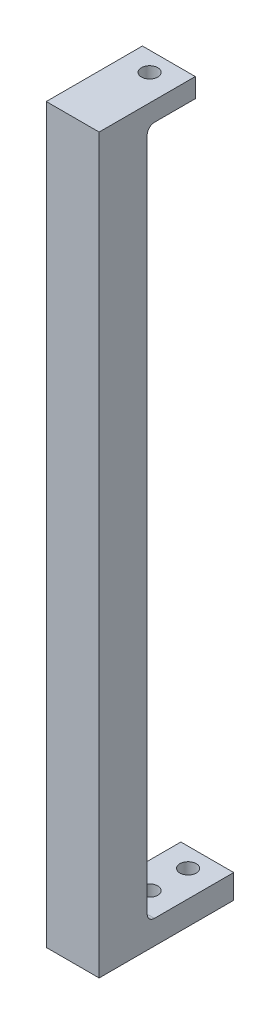
ISO-10303-21;
HEADER;
FILE_DESCRIPTION(('STEP AP214'),'2;1');
FILE_NAME('part.step','',(''),(''),'','','');
FILE_SCHEMA(('AUTOMOTIVE_DESIGN { 1 0 10303 214 1 1 1 1 }'));
ENDSEC;
DATA;
#1=APPLICATION_CONTEXT('core data for automotive mechanical design processes');
#2=APPLICATION_PROTOCOL_DEFINITION('international standard','automotive_design',2000,#1);
#3=PRODUCT_CONTEXT('',#1,'mechanical');
#4=PRODUCT('Part','Part','',(#3));
#5=PRODUCT_RELATED_PRODUCT_CATEGORY('part','',(#4));
#6=PRODUCT_DEFINITION_FORMATION('','',#4);
#7=PRODUCT_DEFINITION_CONTEXT('part definition',#1,'design');
#8=PRODUCT_DEFINITION('design','',#6,#7);
#9=PRODUCT_DEFINITION_SHAPE('','',#8);
#10=(LENGTH_UNIT() NAMED_UNIT(*) SI_UNIT(.MILLI.,.METRE.));
#11=(NAMED_UNIT(*) PLANE_ANGLE_UNIT() SI_UNIT($,.RADIAN.));
#12=(NAMED_UNIT(*) SI_UNIT($,.STERADIAN.) SOLID_ANGLE_UNIT());
#13=UNCERTAINTY_MEASURE_WITH_UNIT(LENGTH_MEASURE(1.E-05),#10,'distance_accuracy_value','');
#14=(GEOMETRIC_REPRESENTATION_CONTEXT(3) GLOBAL_UNCERTAINTY_ASSIGNED_CONTEXT((#13)) GLOBAL_UNIT_ASSIGNED_CONTEXT((#10,
#11,#12)) REPRESENTATION_CONTEXT('',''));
#15=CARTESIAN_POINT('',(0.,0.,0.));
#16=DIRECTION('',(0.,0.,1.));
#17=DIRECTION('',(1.,0.,0.));
#18=AXIS2_PLACEMENT_3D('',#15,#16,#17);
#19=CARTESIAN_POINT('',(-5.5,76.2,-5.));
#20=DIRECTION('',(0.,0.,1.));
#21=DIRECTION('',(1.,0.,0.));
#22=AXIS2_PLACEMENT_3D('',#19,#20,#21);
#23=PLANE('',#22);
#24=DIRECTION('',(0.,-1.,0.));
#25=VECTOR('',#24,1.);
#26=CARTESIAN_POINT('',(-5.5,76.2,-5.));
#27=LINE('',#26,#25);
#28=CARTESIAN_POINT('',(-5.5,70.7,-5.));
#29=VERTEX_POINT('',#28);
#30=CARTESIAN_POINT('',(-5.5,-69.6999999999999,-5.));
#31=VERTEX_POINT('',#30);
#32=EDGE_CURVE('E175',#29,#31,#27,.T.);
#33=ORIENTED_EDGE('',*,*,#32,.F.);
#34=DIRECTION('',(1.,0.,0.));
#35=VECTOR('',#34,1.);
#36=CARTESIAN_POINT('',(-5.5,70.7,-5.));
#37=LINE('',#36,#35);
#38=CARTESIAN_POINT('',(5.5,70.7,-5.));
#39=VERTEX_POINT('',#38);
#40=EDGE_CURVE('E182',#29,#39,#37,.T.);
#41=ORIENTED_EDGE('',*,*,#40,.T.);
#42=DIRECTION('',(0.,-1.,0.));
#43=VECTOR('',#42,1.);
#44=CARTESIAN_POINT('',(5.5,76.2,-5.));
#45=LINE('',#44,#43);
#46=CARTESIAN_POINT('',(5.5,-69.6999999999999,-5.));
#47=VERTEX_POINT('',#46);
#48=EDGE_CURVE('E177',#39,#47,#45,.T.);
#49=ORIENTED_EDGE('',*,*,#48,.T.);
#50=DIRECTION('',(1.,0.,0.));
#51=VECTOR('',#50,1.);
#52=CARTESIAN_POINT('',(-5.5,-69.7,-5.));
#53=LINE('',#52,#51);
#54=EDGE_CURVE('E180',#47,#31,#53,.F.);
#55=ORIENTED_EDGE('',*,*,#54,.T.);
#56=EDGE_LOOP('',(#33,#41,#49,#55));
#57=FACE_BOUND('',#56,.T.);
#58=ADVANCED_FACE('F32',(#57),#23,.F.);
#59=CARTESIAN_POINT('',(5.5,76.2,-5.));
#60=DIRECTION('',(-1.,0.,0.));
#61=DIRECTION('',(0.,0.,1.));
#62=AXIS2_PLACEMENT_3D('',#59,#60,#61);
#63=PLANE('',#62);
#64=DIRECTION('',(0.,0.,-1.));
#65=VECTOR('',#64,1.);
#66=CARTESIAN_POINT('',(5.5,-76.2,-5.));
#67=LINE('',#66,#65);
#68=CARTESIAN_POINT('',(5.5,-76.2,5.));
#69=VERTEX_POINT('',#68);
#70=CARTESIAN_POINT('',(5.5,-76.2,-23.));
#71=VERTEX_POINT('',#70);
#72=EDGE_CURVE('E156',#69,#71,#67,.T.);
#73=ORIENTED_EDGE('',*,*,#72,.T.);
#74=DIRECTION('',(0.,-1.,0.));
#75=VECTOR('',#74,1.);
#76=CARTESIAN_POINT('',(5.5,-71.2,-23.));
#77=LINE('',#76,#75);
#78=CARTESIAN_POINT('',(5.5,-71.2,-23.));
#79=VERTEX_POINT('',#78);
#80=EDGE_CURVE('E122',#79,#71,#77,.T.);
#81=ORIENTED_EDGE('',*,*,#80,.F.);
#82=DIRECTION('',(0.,0.,1.));
#83=VECTOR('',#82,1.);
#84=CARTESIAN_POINT('',(5.5,-71.2,5.));
#85=LINE('',#84,#83);
#86=CARTESIAN_POINT('',(5.5,-71.2,-6.5));
#87=VERTEX_POINT('',#86);
#88=EDGE_CURVE('E123',#79,#87,#85,.T.);
#89=ORIENTED_EDGE('',*,*,#88,.T.);
#90=CARTESIAN_POINT('',(5.5,-69.7,-6.5));
#91=DIRECTION('',(-1.,0.,0.));
#92=DIRECTION('',(0.,0.,1.));
#93=AXIS2_PLACEMENT_3D('',#90,#91,#92);
#94=CIRCLE('',#93,1.5);
#95=EDGE_CURVE('E40',#87,#47,#94,.T.);
#96=ORIENTED_EDGE('',*,*,#95,.T.);
#97=ORIENTED_EDGE('',*,*,#48,.F.);
#98=CARTESIAN_POINT('',(5.5,70.7,-6.5));
#99=DIRECTION('',(-1.,0.,0.));
#100=DIRECTION('',(0.,0.,1.));
#101=AXIS2_PLACEMENT_3D('',#98,#99,#100);
#102=CIRCLE('',#101,1.5);
#103=CARTESIAN_POINT('',(5.5,72.2,-6.5));
#104=VERTEX_POINT('',#103);
#105=EDGE_CURVE('E189',#39,#104,#102,.T.);
#106=ORIENTED_EDGE('',*,*,#105,.T.);
#107=DIRECTION('',(0.,0.,-1.));
#108=VECTOR('',#107,1.);
#109=CARTESIAN_POINT('',(5.5,72.2,-15.));
#110=LINE('',#109,#108);
#111=CARTESIAN_POINT('',(5.5,72.2,-15.));
#112=VERTEX_POINT('',#111);
#113=EDGE_CURVE('E142',#104,#112,#110,.T.);
#114=ORIENTED_EDGE('',*,*,#113,.T.);
#115=DIRECTION('',(0.,1.,0.));
#116=VECTOR('',#115,1.);
#117=CARTESIAN_POINT('',(5.5,72.2,-15.));
#118=LINE('',#117,#116);
#119=CARTESIAN_POINT('',(5.5,76.2,-15.));
#120=VERTEX_POINT('',#119);
#121=EDGE_CURVE('E150',#112,#120,#118,.T.);
#122=ORIENTED_EDGE('',*,*,#121,.T.);
#123=DIRECTION('',(0.,0.,-1.));
#124=VECTOR('',#123,1.);
#125=CARTESIAN_POINT('',(5.5,76.2,-5.));
#126=LINE('',#125,#124);
#127=CARTESIAN_POINT('',(5.5,76.2,5.));
#128=VERTEX_POINT('',#127);
#129=EDGE_CURVE('E159',#128,#120,#126,.T.);
#130=ORIENTED_EDGE('',*,*,#129,.F.);
#131=DIRECTION('',(0.,-1.,0.));
#132=VECTOR('',#131,1.);
#133=CARTESIAN_POINT('',(5.5,76.2,5.));
#134=LINE('',#133,#132);
#135=EDGE_CURVE('E166',#128,#69,#134,.T.);
#136=ORIENTED_EDGE('',*,*,#135,.T.);
#137=EDGE_LOOP('',(#73,#81,#89,#96,#97,#106,#114,#122,#130,#136));
#138=FACE_BOUND('',#137,.T.);
#139=ADVANCED_FACE('F194',(#138),#63,.F.);
#140=CARTESIAN_POINT('',(-5.5,76.2,-5.));
#141=DIRECTION('',(1.,0.,0.));
#142=DIRECTION('',(0.,0.,-1.));
#143=AXIS2_PLACEMENT_3D('',#140,#141,#142);
#144=PLANE('',#143);
#145=DIRECTION('',(0.,0.,1.));
#146=VECTOR('',#145,1.);
#147=CARTESIAN_POINT('',(-5.5,-76.2,-5.));
#148=LINE('',#147,#146);
#149=CARTESIAN_POINT('',(-5.5,-76.2,-23.));
#150=VERTEX_POINT('',#149);
#151=CARTESIAN_POINT('',(-5.5,-76.2,5.));
#152=VERTEX_POINT('',#151);
#153=EDGE_CURVE('E168',#150,#152,#148,.T.);
#154=ORIENTED_EDGE('',*,*,#153,.T.);
#155=DIRECTION('',(0.,-1.,0.));
#156=VECTOR('',#155,1.);
#157=CARTESIAN_POINT('',(-5.5,76.2,5.));
#158=LINE('',#157,#156);
#159=CARTESIAN_POINT('',(-5.5,76.2,5.));
#160=VERTEX_POINT('',#159);
#161=EDGE_CURVE('E173',#160,#152,#158,.T.);
#162=ORIENTED_EDGE('',*,*,#161,.F.);
#163=DIRECTION('',(0.,0.,1.));
#164=VECTOR('',#163,1.);
#165=CARTESIAN_POINT('',(-5.5,76.2,-5.));
#166=LINE('',#165,#164);
#167=CARTESIAN_POINT('',(-5.5,76.2,-15.));
#168=VERTEX_POINT('',#167);
#169=EDGE_CURVE('E161',#168,#160,#166,.T.);
#170=ORIENTED_EDGE('',*,*,#169,.F.);
#171=DIRECTION('',(0.,1.,0.));
#172=VECTOR('',#171,1.);
#173=CARTESIAN_POINT('',(-5.5,72.2,-15.));
#174=LINE('',#173,#172);
#175=CARTESIAN_POINT('',(-5.5,72.2,-15.));
#176=VERTEX_POINT('',#175);
#177=EDGE_CURVE('E153',#176,#168,#174,.T.);
#178=ORIENTED_EDGE('',*,*,#177,.F.);
#179=DIRECTION('',(0.,0.,1.));
#180=VECTOR('',#179,1.);
#181=CARTESIAN_POINT('',(-5.5,72.2,-15.));
#182=LINE('',#181,#180);
#183=CARTESIAN_POINT('',(-5.5,72.2,-6.5));
#184=VERTEX_POINT('',#183);
#185=EDGE_CURVE('E147',#176,#184,#182,.T.);
#186=ORIENTED_EDGE('',*,*,#185,.T.);
#187=CARTESIAN_POINT('',(-5.5,70.7,-6.5));
#188=DIRECTION('',(1.,0.,0.));
#189=DIRECTION('',(0.,0.,-1.));
#190=AXIS2_PLACEMENT_3D('',#187,#188,#189);
#191=CIRCLE('',#190,1.5);
#192=EDGE_CURVE('E191',#184,#29,#191,.T.);
#193=ORIENTED_EDGE('',*,*,#192,.T.);
#194=ORIENTED_EDGE('',*,*,#32,.T.);
#195=CARTESIAN_POINT('',(-5.5,-69.7,-6.5));
#196=DIRECTION('',(1.,0.,0.));
#197=DIRECTION('',(0.,0.,-1.));
#198=AXIS2_PLACEMENT_3D('',#195,#196,#197);
#199=CIRCLE('',#198,1.5);
#200=CARTESIAN_POINT('',(-5.5,-71.2,-6.5));
#201=VERTEX_POINT('',#200);
#202=EDGE_CURVE('E11',#31,#201,#199,.T.);
#203=ORIENTED_EDGE('',*,*,#202,.T.);
#204=DIRECTION('',(0.,0.,-1.));
#205=VECTOR('',#204,1.);
#206=CARTESIAN_POINT('',(-5.5,-71.2,5.));
#207=LINE('',#206,#205);
#208=CARTESIAN_POINT('',(-5.5,-71.2,-23.));
#209=VERTEX_POINT('',#208);
#210=EDGE_CURVE('E106',#201,#209,#207,.T.);
#211=ORIENTED_EDGE('',*,*,#210,.T.);
#212=DIRECTION('',(0.,-1.,0.));
#213=VECTOR('',#212,1.);
#214=CARTESIAN_POINT('',(-5.5,-71.2,-23.));
#215=LINE('',#214,#213);
#216=EDGE_CURVE('E110',#209,#150,#215,.T.);
#217=ORIENTED_EDGE('',*,*,#216,.T.);
#218=EDGE_LOOP('',(#154,#162,#170,#178,#186,#193,#194,#203,#211,#217));
#219=FACE_BOUND('',#218,.T.);
#220=ADVANCED_FACE('F109',(#219),#144,.F.);
#221=CARTESIAN_POINT('',(-5.5,76.2,5.));
#222=DIRECTION('',(0.,0.,-1.));
#223=DIRECTION('',(-1.,0.,0.));
#224=AXIS2_PLACEMENT_3D('',#221,#222,#223);
#225=PLANE('',#224);
#226=DIRECTION('',(1.,0.,0.));
#227=VECTOR('',#226,1.);
#228=CARTESIAN_POINT('',(-5.5,-76.2,5.));
#229=LINE('',#228,#227);
#230=EDGE_CURVE('E162',#152,#69,#229,.T.);
#231=ORIENTED_EDGE('',*,*,#230,.T.);
#232=ORIENTED_EDGE('',*,*,#135,.F.);
#233=DIRECTION('',(1.,0.,0.));
#234=VECTOR('',#233,1.);
#235=CARTESIAN_POINT('',(-5.5,76.2,5.));
#236=LINE('',#235,#234);
#237=EDGE_CURVE('E164',#160,#128,#236,.T.);
#238=ORIENTED_EDGE('',*,*,#237,.F.);
#239=ORIENTED_EDGE('',*,*,#161,.T.);
#240=EDGE_LOOP('',(#231,#232,#238,#239));
#241=FACE_BOUND('',#240,.T.);
#242=ADVANCED_FACE('F214',(#241),#225,.F.);
#243=CARTESIAN_POINT('',(0.,76.2,0.));
#244=DIRECTION('',(0.,1.,0.));
#245=DIRECTION('',(0.,0.,1.));
#246=AXIS2_PLACEMENT_3D('',#243,#244,#245);
#247=PLANE('',#246);
#248=ORIENTED_EDGE('',*,*,#129,.T.);
#249=DIRECTION('',(-1.,0.,0.));
#250=VECTOR('',#249,1.);
#251=CARTESIAN_POINT('',(5.5,76.2,-15.));
#252=LINE('',#251,#250);
#253=EDGE_CURVE('E139',#120,#168,#252,.T.);
#254=ORIENTED_EDGE('',*,*,#253,.T.);
#255=ORIENTED_EDGE('',*,*,#169,.T.);
#256=ORIENTED_EDGE('',*,*,#237,.T.);
#257=EDGE_LOOP('',(#248,#254,#255,#256));
#258=FACE_BOUND('',#257,.T.);
#259=CARTESIAN_POINT('',(0.,76.2,-11.));
#260=DIRECTION('',(0.,1.,0.));
#261=DIRECTION('',(0.,0.,1.));
#262=AXIS2_PLACEMENT_3D('',#259,#260,#261);
#263=CIRCLE('',#262,1.7);
#264=CARTESIAN_POINT('',(0.,76.2,-9.3));
#265=VERTEX_POINT('',#264);
#266=EDGE_CURVE('E134',#265,#265,#263,.T.);
#267=ORIENTED_EDGE('',*,*,#266,.F.);
#268=EDGE_LOOP('',(#267));
#269=FACE_BOUND('',#268,.T.);
#270=ADVANCED_FACE('F217',(#258,#269),#247,.T.);
#271=CARTESIAN_POINT('',(0.,-76.2,0.));
#272=DIRECTION('',(0.,1.,0.));
#273=DIRECTION('',(0.,0.,1.));
#274=AXIS2_PLACEMENT_3D('',#271,#272,#273);
#275=PLANE('',#274);
#276=ORIENTED_EDGE('',*,*,#72,.F.);
#277=ORIENTED_EDGE('',*,*,#230,.F.);
#278=ORIENTED_EDGE('',*,*,#153,.F.);
#279=DIRECTION('',(1.,0.,0.));
#280=VECTOR('',#279,1.);
#281=CARTESIAN_POINT('',(-5.5,-76.2,-23.));
#282=LINE('',#281,#280);
#283=EDGE_CURVE('E115',#150,#71,#282,.T.);
#284=ORIENTED_EDGE('',*,*,#283,.T.);
#285=EDGE_LOOP('',(#276,#277,#278,#284));
#286=FACE_BOUND('',#285,.T.);
#287=CARTESIAN_POINT('',(0.,-76.2,-11.));
#288=DIRECTION('',(0.,-1.,0.));
#289=DIRECTION('',(0.,0.,-1.));
#290=AXIS2_PLACEMENT_3D('',#287,#288,#289);
#291=CIRCLE('',#290,1.7);
#292=CARTESIAN_POINT('',(0.,-76.2,-12.7));
#293=VERTEX_POINT('',#292);
#294=EDGE_CURVE('E260',#293,#293,#291,.T.);
#295=ORIENTED_EDGE('',*,*,#294,.F.);
#296=EDGE_LOOP('',(#295));
#297=FACE_BOUND('',#296,.T.);
#298=CARTESIAN_POINT('',(0.,-76.2,-19.));
#299=DIRECTION('',(0.,-1.,0.));
#300=DIRECTION('',(0.,0.,-1.));
#301=AXIS2_PLACEMENT_3D('',#298,#299,#300);
#302=CIRCLE('',#301,1.7);
#303=CARTESIAN_POINT('',(0.,-76.2,-20.7));
#304=VERTEX_POINT('',#303);
#305=EDGE_CURVE('E257',#304,#304,#302,.T.);
#306=ORIENTED_EDGE('',*,*,#305,.F.);
#307=EDGE_LOOP('',(#306));
#308=FACE_BOUND('',#307,.T.);
#309=ADVANCED_FACE('F219',(#286,#297,#308),#275,.F.);
#310=CARTESIAN_POINT('',(0.,72.2,0.));
#311=DIRECTION('',(0.,-1.,0.));
#312=DIRECTION('',(0.,0.,-1.));
#313=AXIS2_PLACEMENT_3D('',#310,#311,#312);
#314=PLANE('',#313);
#315=CARTESIAN_POINT('',(0.,72.2,-11.));
#316=DIRECTION('',(0.,1.,0.));
#317=DIRECTION('',(0.,0.,1.));
#318=AXIS2_PLACEMENT_3D('',#315,#316,#317);
#319=CIRCLE('',#318,1.7);
#320=CARTESIAN_POINT('',(0.,72.2,-9.3));
#321=VERTEX_POINT('',#320);
#322=EDGE_CURVE('E136',#321,#321,#319,.T.);
#323=ORIENTED_EDGE('',*,*,#322,.T.);
#324=EDGE_LOOP('',(#323));
#325=FACE_BOUND('',#324,.T.);
#326=ORIENTED_EDGE('',*,*,#113,.F.);
#327=DIRECTION('',(1.,0.,0.));
#328=VECTOR('',#327,1.);
#329=CARTESIAN_POINT('',(0.,72.2,-6.5));
#330=LINE('',#329,#328);
#331=EDGE_CURVE('E185',#104,#184,#330,.F.);
#332=ORIENTED_EDGE('',*,*,#331,.T.);
#333=ORIENTED_EDGE('',*,*,#185,.F.);
#334=DIRECTION('',(-1.,0.,0.));
#335=VECTOR('',#334,1.);
#336=CARTESIAN_POINT('',(5.5,72.2,-15.));
#337=LINE('',#336,#335);
#338=EDGE_CURVE('E144',#112,#176,#337,.T.);
#339=ORIENTED_EDGE('',*,*,#338,.F.);
#340=EDGE_LOOP('',(#326,#332,#333,#339));
#341=FACE_BOUND('',#340,.T.);
#342=ADVANCED_FACE('F222',(#325,#341),#314,.T.);
#343=CARTESIAN_POINT('',(5.5,72.2,-15.));
#344=DIRECTION('',(0.,0.,-1.));
#345=DIRECTION('',(-1.,0.,0.));
#346=AXIS2_PLACEMENT_3D('',#343,#344,#345);
#347=PLANE('',#346);
#348=ORIENTED_EDGE('',*,*,#253,.F.);
#349=ORIENTED_EDGE('',*,*,#121,.F.);
#350=ORIENTED_EDGE('',*,*,#338,.T.);
#351=ORIENTED_EDGE('',*,*,#177,.T.);
#352=EDGE_LOOP('',(#348,#349,#350,#351));
#353=FACE_BOUND('',#352,.T.);
#354=ADVANCED_FACE('F227',(#353),#347,.T.);
#355=CARTESIAN_POINT('',(0.,72.2,-11.));
#356=DIRECTION('',(0.,1.,0.));
#357=DIRECTION('',(0.,0.,1.));
#358=AXIS2_PLACEMENT_3D('',#355,#356,#357);
#359=CYLINDRICAL_SURFACE('',#358,1.7);
#360=ORIENTED_EDGE('',*,*,#322,.F.);
#361=EDGE_LOOP('',(#360));
#362=FACE_BOUND('',#361,.T.);
#363=ORIENTED_EDGE('',*,*,#266,.T.);
#364=EDGE_LOOP('',(#363));
#365=FACE_BOUND('',#364,.T.);
#366=ADVANCED_FACE('F230',(#362,#365),#359,.F.);
#367=CARTESIAN_POINT('',(0.,-71.2,0.));
#368=DIRECTION('',(0.,-1.,0.));
#369=DIRECTION('',(0.,0.,-1.));
#370=AXIS2_PLACEMENT_3D('',#367,#368,#369);
#371=PLANE('',#370);
#372=CARTESIAN_POINT('',(0.,-71.2,-19.));
#373=DIRECTION('',(0.,-1.,0.));
#374=DIRECTION('',(0.,0.,-1.));
#375=AXIS2_PLACEMENT_3D('',#372,#373,#374);
#376=CIRCLE('',#375,1.7);
#377=CARTESIAN_POINT('',(0.,-71.2,-20.7));
#378=VERTEX_POINT('',#377);
#379=EDGE_CURVE('E254',#378,#378,#376,.T.);
#380=ORIENTED_EDGE('',*,*,#379,.T.);
#381=EDGE_LOOP('',(#380));
#382=FACE_BOUND('',#381,.T.);
#383=CARTESIAN_POINT('',(0.,-71.2,-11.));
#384=DIRECTION('',(0.,-1.,0.));
#385=DIRECTION('',(0.,0.,-1.));
#386=AXIS2_PLACEMENT_3D('',#383,#384,#385);
#387=CIRCLE('',#386,1.7);
#388=CARTESIAN_POINT('',(0.,-71.2,-12.7));
#389=VERTEX_POINT('',#388);
#390=EDGE_CURVE('E133',#389,#389,#387,.T.);
#391=ORIENTED_EDGE('',*,*,#390,.T.);
#392=EDGE_LOOP('',(#391));
#393=FACE_BOUND('',#392,.T.);
#394=ORIENTED_EDGE('',*,*,#210,.F.);
#395=DIRECTION('',(1.,0.,0.));
#396=VECTOR('',#395,1.);
#397=CARTESIAN_POINT('',(5.5,-71.2,-6.5));
#398=LINE('',#397,#396);
#399=EDGE_CURVE('E187',#201,#87,#398,.T.);
#400=ORIENTED_EDGE('',*,*,#399,.T.);
#401=ORIENTED_EDGE('',*,*,#88,.F.);
#402=DIRECTION('',(1.,0.,0.));
#403=VECTOR('',#402,1.);
#404=CARTESIAN_POINT('',(-5.5,-71.2,-23.));
#405=LINE('',#404,#403);
#406=EDGE_CURVE('E114',#209,#79,#405,.T.);
#407=ORIENTED_EDGE('',*,*,#406,.F.);
#408=EDGE_LOOP('',(#394,#400,#401,#407));
#409=FACE_BOUND('',#408,.T.);
#410=ADVANCED_FACE('F126',(#382,#393,#409),#371,.F.);
#411=CARTESIAN_POINT('',(-5.5,-71.2,-23.));
#412=DIRECTION('',(0.,0.,-1.));
#413=DIRECTION('',(-1.,0.,0.));
#414=AXIS2_PLACEMENT_3D('',#411,#412,#413);
#415=PLANE('',#414);
#416=ORIENTED_EDGE('',*,*,#283,.F.);
#417=ORIENTED_EDGE('',*,*,#216,.F.);
#418=ORIENTED_EDGE('',*,*,#406,.T.);
#419=ORIENTED_EDGE('',*,*,#80,.T.);
#420=EDGE_LOOP('',(#416,#417,#418,#419));
#421=FACE_BOUND('',#420,.T.);
#422=ADVANCED_FACE('F119',(#421),#415,.T.);
#423=CARTESIAN_POINT('',(0.,-71.2,-11.));
#424=DIRECTION('',(0.,-1.,0.));
#425=DIRECTION('',(0.,0.,-1.));
#426=AXIS2_PLACEMENT_3D('',#423,#424,#425);
#427=CYLINDRICAL_SURFACE('',#426,1.7);
#428=ORIENTED_EDGE('',*,*,#390,.F.);
#429=EDGE_LOOP('',(#428));
#430=FACE_BOUND('',#429,.T.);
#431=ORIENTED_EDGE('',*,*,#294,.T.);
#432=EDGE_LOOP('',(#431));
#433=FACE_BOUND('',#432,.T.);
#434=ADVANCED_FACE('F240',(#430,#433),#427,.F.);
#435=CARTESIAN_POINT('',(0.,-71.2,-19.));
#436=DIRECTION('',(0.,-1.,0.));
#437=DIRECTION('',(0.,0.,-1.));
#438=AXIS2_PLACEMENT_3D('',#435,#436,#437);
#439=CYLINDRICAL_SURFACE('',#438,1.7);
#440=ORIENTED_EDGE('',*,*,#379,.F.);
#441=EDGE_LOOP('',(#440));
#442=FACE_BOUND('',#441,.T.);
#443=ORIENTED_EDGE('',*,*,#305,.T.);
#444=EDGE_LOOP('',(#443));
#445=FACE_BOUND('',#444,.T.);
#446=ADVANCED_FACE('F203',(#442,#445),#439,.F.);
#447=CARTESIAN_POINT('',(-5.5,70.7,-6.5));
#448=DIRECTION('',(1.,0.,0.));
#449=DIRECTION('',(0.,0.,-1.));
#450=AXIS2_PLACEMENT_3D('',#447,#448,#449);
#451=CYLINDRICAL_SURFACE('',#450,1.5);
#452=ORIENTED_EDGE('',*,*,#192,.F.);
#453=ORIENTED_EDGE('',*,*,#331,.F.);
#454=ORIENTED_EDGE('',*,*,#105,.F.);
#455=ORIENTED_EDGE('',*,*,#40,.F.);
#456=EDGE_LOOP('',(#452,#453,#454,#455));
#457=FACE_BOUND('',#456,.T.);
#458=ADVANCED_FACE('F199',(#457),#451,.F.);
#459=CARTESIAN_POINT('',(0.,-69.7,-6.5));
#460=DIRECTION('',(-1.,0.,0.));
#461=DIRECTION('',(0.,0.,1.));
#462=AXIS2_PLACEMENT_3D('',#459,#460,#461);
#463=CYLINDRICAL_SURFACE('',#462,1.5);
#464=ORIENTED_EDGE('',*,*,#202,.F.);
#465=ORIENTED_EDGE('',*,*,#54,.F.);
#466=ORIENTED_EDGE('',*,*,#95,.F.);
#467=ORIENTED_EDGE('',*,*,#399,.F.);
#468=EDGE_LOOP('',(#464,#465,#466,#467));
#469=FACE_BOUND('',#468,.T.);
#470=ADVANCED_FACE('F34',(#469),#463,.F.);
#471=CLOSED_SHELL('',(#58,#139,#220,#242,#270,#309,#342,#354,#366,#410,#422,#434,#446,#458,#470));
#472=MANIFOLD_SOLID_BREP('B2',#471);
#473=ADVANCED_BREP_SHAPE_REPRESENTATION('',(#18,#472),#14);
#474=SHAPE_DEFINITION_REPRESENTATION(#9,#473);
ENDSEC;
END-ISO-10303-21;
